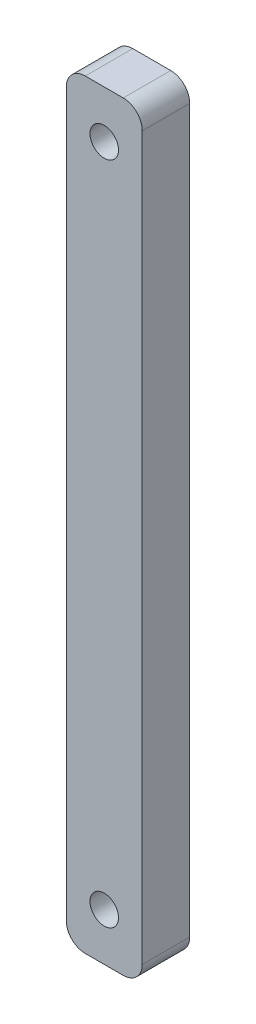
ISO-10303-21;
HEADER;
FILE_DESCRIPTION(('STEP AP214'),'2;1');
FILE_NAME('part.step','',(''),(''),'','','');
FILE_SCHEMA(('AUTOMOTIVE_DESIGN { 1 0 10303 214 1 1 1 1 }'));
ENDSEC;
DATA;
#1=APPLICATION_CONTEXT('core data for automotive mechanical design processes');
#2=APPLICATION_PROTOCOL_DEFINITION('international standard','automotive_design',2000,#1);
#3=PRODUCT_CONTEXT('',#1,'mechanical');
#4=PRODUCT('Part','Part','',(#3));
#5=PRODUCT_RELATED_PRODUCT_CATEGORY('part','',(#4));
#6=PRODUCT_DEFINITION_FORMATION('','',#4);
#7=PRODUCT_DEFINITION_CONTEXT('part definition',#1,'design');
#8=PRODUCT_DEFINITION('design','',#6,#7);
#9=PRODUCT_DEFINITION_SHAPE('','',#8);
#10=(LENGTH_UNIT() NAMED_UNIT(*) SI_UNIT(.MILLI.,.METRE.));
#11=(NAMED_UNIT(*) PLANE_ANGLE_UNIT() SI_UNIT($,.RADIAN.));
#12=(NAMED_UNIT(*) SI_UNIT($,.STERADIAN.) SOLID_ANGLE_UNIT());
#13=UNCERTAINTY_MEASURE_WITH_UNIT(LENGTH_MEASURE(1.E-05),#10,'distance_accuracy_value','');
#14=(GEOMETRIC_REPRESENTATION_CONTEXT(3) GLOBAL_UNCERTAINTY_ASSIGNED_CONTEXT((#13)) GLOBAL_UNIT_ASSIGNED_CONTEXT((#10,
#11,#12)) REPRESENTATION_CONTEXT('',''));
#15=CARTESIAN_POINT('',(0.,0.,0.));
#16=DIRECTION('',(0.,0.,1.));
#17=DIRECTION('',(1.,0.,0.));
#18=AXIS2_PLACEMENT_3D('',#15,#16,#17);
#19=CARTESIAN_POINT('',(-4.,-40.,5.));
#20=DIRECTION('',(1.,0.,0.));
#21=DIRECTION('',(0.,0.,-1.));
#22=AXIS2_PLACEMENT_3D('',#19,#20,#21);
#23=PLANE('',#22);
#24=DIRECTION('',(0.,-1.,0.));
#25=VECTOR('',#24,1.);
#26=CARTESIAN_POINT('',(-4.,-40.,0.));
#27=LINE('',#26,#25);
#28=CARTESIAN_POINT('',(-4.,38.,0.));
#29=VERTEX_POINT('',#28);
#30=CARTESIAN_POINT('',(-4.,-38.,0.));
#31=VERTEX_POINT('',#30);
#32=EDGE_CURVE('E139',#29,#31,#27,.T.);
#33=ORIENTED_EDGE('',*,*,#32,.T.);
#34=DIRECTION('',(0.,0.,-1.));
#35=VECTOR('',#34,1.);
#36=CARTESIAN_POINT('',(-4.,-38.,5.));
#37=LINE('',#36,#35);
#38=CARTESIAN_POINT('',(-4.,-38.,5.));
#39=VERTEX_POINT('',#38);
#40=EDGE_CURVE('E114',#31,#39,#37,.F.);
#41=ORIENTED_EDGE('',*,*,#40,.T.);
#42=DIRECTION('',(0.,-1.,0.));
#43=VECTOR('',#42,1.);
#44=CARTESIAN_POINT('',(-4.,-40.,5.));
#45=LINE('',#44,#43);
#46=CARTESIAN_POINT('',(-4.,38.,5.));
#47=VERTEX_POINT('',#46);
#48=EDGE_CURVE('E152',#47,#39,#45,.T.);
#49=ORIENTED_EDGE('',*,*,#48,.F.);
#50=DIRECTION('',(0.,0.,-1.));
#51=VECTOR('',#50,1.);
#52=CARTESIAN_POINT('',(-4.,38.,5.));
#53=LINE('',#52,#51);
#54=EDGE_CURVE('E120',#47,#29,#53,.T.);
#55=ORIENTED_EDGE('',*,*,#54,.T.);
#56=EDGE_LOOP('',(#33,#41,#49,#55));
#57=FACE_BOUND('',#56,.T.);
#58=ADVANCED_FACE('F42',(#57),#23,.F.);
#59=CARTESIAN_POINT('',(4.,-40.,5.));
#60=DIRECTION('',(0.,1.,0.));
#61=DIRECTION('',(0.,0.,1.));
#62=AXIS2_PLACEMENT_3D('',#59,#60,#61);
#63=PLANE('',#62);
#64=DIRECTION('',(1.,0.,0.));
#65=VECTOR('',#64,1.);
#66=CARTESIAN_POINT('',(4.,-40.,5.));
#67=LINE('',#66,#65);
#68=CARTESIAN_POINT('',(-2.,-40.,5.));
#69=VERTEX_POINT('',#68);
#70=CARTESIAN_POINT('',(2.,-40.,5.));
#71=VERTEX_POINT('',#70);
#72=EDGE_CURVE('E130',#69,#71,#67,.T.);
#73=ORIENTED_EDGE('',*,*,#72,.F.);
#74=DIRECTION('',(0.,0.,-1.));
#75=VECTOR('',#74,1.);
#76=CARTESIAN_POINT('',(-2.,-40.,5.));
#77=LINE('',#76,#75);
#78=CARTESIAN_POINT('',(-2.,-40.,0.));
#79=VERTEX_POINT('',#78);
#80=EDGE_CURVE('E113',#69,#79,#77,.T.);
#81=ORIENTED_EDGE('',*,*,#80,.T.);
#82=DIRECTION('',(1.,0.,0.));
#83=VECTOR('',#82,1.);
#84=CARTESIAN_POINT('',(4.,-40.,0.));
#85=LINE('',#84,#83);
#86=CARTESIAN_POINT('',(2.,-40.,0.));
#87=VERTEX_POINT('',#86);
#88=EDGE_CURVE('E127',#79,#87,#85,.T.);
#89=ORIENTED_EDGE('',*,*,#88,.T.);
#90=DIRECTION('',(0.,0.,-1.));
#91=VECTOR('',#90,1.);
#92=CARTESIAN_POINT('',(2.,-40.,5.));
#93=LINE('',#92,#91);
#94=EDGE_CURVE('E133',#87,#71,#93,.F.);
#95=ORIENTED_EDGE('',*,*,#94,.T.);
#96=EDGE_LOOP('',(#73,#81,#89,#95));
#97=FACE_BOUND('',#96,.T.);
#98=ADVANCED_FACE('F126',(#97),#63,.F.);
#99=CARTESIAN_POINT('',(4.,-40.,5.));
#100=DIRECTION('',(-1.,0.,0.));
#101=DIRECTION('',(0.,0.,1.));
#102=AXIS2_PLACEMENT_3D('',#99,#100,#101);
#103=PLANE('',#102);
#104=DIRECTION('',(0.,1.,0.));
#105=VECTOR('',#104,1.);
#106=CARTESIAN_POINT('',(4.,-40.,5.));
#107=LINE('',#106,#105);
#108=CARTESIAN_POINT('',(4.,-38.,5.));
#109=VERTEX_POINT('',#108);
#110=CARTESIAN_POINT('',(4.,38.,5.));
#111=VERTEX_POINT('',#110);
#112=EDGE_CURVE('E188',#109,#111,#107,.T.);
#113=ORIENTED_EDGE('',*,*,#112,.F.);
#114=DIRECTION('',(0.,0.,-1.));
#115=VECTOR('',#114,1.);
#116=CARTESIAN_POINT('',(4.,-38.,5.));
#117=LINE('',#116,#115);
#118=CARTESIAN_POINT('',(4.,-38.,0.));
#119=VERTEX_POINT('',#118);
#120=EDGE_CURVE('E182',#109,#119,#117,.T.);
#121=ORIENTED_EDGE('',*,*,#120,.T.);
#122=DIRECTION('',(0.,1.,0.));
#123=VECTOR('',#122,1.);
#124=CARTESIAN_POINT('',(4.,-40.,0.));
#125=LINE('',#124,#123);
#126=CARTESIAN_POINT('',(4.,38.,0.));
#127=VERTEX_POINT('',#126);
#128=EDGE_CURVE('E138',#119,#127,#125,.T.);
#129=ORIENTED_EDGE('',*,*,#128,.T.);
#130=DIRECTION('',(0.,0.,-1.));
#131=VECTOR('',#130,1.);
#132=CARTESIAN_POINT('',(4.,38.,5.));
#133=LINE('',#132,#131);
#134=EDGE_CURVE('E179',#127,#111,#133,.F.);
#135=ORIENTED_EDGE('',*,*,#134,.T.);
#136=EDGE_LOOP('',(#113,#121,#129,#135));
#137=FACE_BOUND('',#136,.T.);
#138=ADVANCED_FACE('F245',(#137),#103,.F.);
#139=CARTESIAN_POINT('',(4.,40.,5.));
#140=DIRECTION('',(0.,-1.,0.));
#141=DIRECTION('',(0.,0.,-1.));
#142=AXIS2_PLACEMENT_3D('',#139,#140,#141);
#143=PLANE('',#142);
#144=DIRECTION('',(-1.,0.,0.));
#145=VECTOR('',#144,1.);
#146=CARTESIAN_POINT('',(4.,40.,5.));
#147=LINE('',#146,#145);
#148=CARTESIAN_POINT('',(2.,40.,5.));
#149=VERTEX_POINT('',#148);
#150=CARTESIAN_POINT('',(-2.,40.,5.));
#151=VERTEX_POINT('',#150);
#152=EDGE_CURVE('E154',#149,#151,#147,.T.);
#153=ORIENTED_EDGE('',*,*,#152,.F.);
#154=DIRECTION('',(0.,0.,-1.));
#155=VECTOR('',#154,1.);
#156=CARTESIAN_POINT('',(2.,40.,5.));
#157=LINE('',#156,#155);
#158=CARTESIAN_POINT('',(2.,40.,0.));
#159=VERTEX_POINT('',#158);
#160=EDGE_CURVE('E11',#149,#159,#157,.T.);
#161=ORIENTED_EDGE('',*,*,#160,.T.);
#162=DIRECTION('',(-1.,0.,0.));
#163=VECTOR('',#162,1.);
#164=CARTESIAN_POINT('',(4.,40.,0.));
#165=LINE('',#164,#163);
#166=CARTESIAN_POINT('',(-2.,40.,0.));
#167=VERTEX_POINT('',#166);
#168=EDGE_CURVE('E144',#159,#167,#165,.T.);
#169=ORIENTED_EDGE('',*,*,#168,.T.);
#170=DIRECTION('',(0.,0.,-1.));
#171=VECTOR('',#170,1.);
#172=CARTESIAN_POINT('',(-2.,40.,5.));
#173=LINE('',#172,#171);
#174=EDGE_CURVE('E51',#167,#151,#173,.F.);
#175=ORIENTED_EDGE('',*,*,#174,.T.);
#176=EDGE_LOOP('',(#153,#161,#169,#175));
#177=FACE_BOUND('',#176,.T.);
#178=ADVANCED_FACE('F225',(#177),#143,.F.);
#179=CARTESIAN_POINT('',(0.,0.,5.));
#180=DIRECTION('',(0.,0.,1.));
#181=DIRECTION('',(1.,0.,0.));
#182=AXIS2_PLACEMENT_3D('',#179,#180,#181);
#183=PLANE('',#182);
#184=CARTESIAN_POINT('',(0.,35.,5.));
#185=DIRECTION('',(0.,0.,1.));
#186=DIRECTION('',(1.,0.,0.));
#187=AXIS2_PLACEMENT_3D('',#184,#185,#186);
#188=CIRCLE('',#187,1.5);
#189=CARTESIAN_POINT('',(1.5,35.,5.));
#190=VERTEX_POINT('',#189);
#191=EDGE_CURVE('E205',#190,#190,#188,.T.);
#192=ORIENTED_EDGE('',*,*,#191,.F.);
#193=EDGE_LOOP('',(#192));
#194=FACE_BOUND('',#193,.T.);
#195=CARTESIAN_POINT('',(0.,-35.,5.));
#196=DIRECTION('',(0.,0.,1.));
#197=DIRECTION('',(1.,0.,0.));
#198=AXIS2_PLACEMENT_3D('',#195,#196,#197);
#199=CIRCLE('',#198,1.5);
#200=CARTESIAN_POINT('',(1.50000000000001,-35.,5.));
#201=VERTEX_POINT('',#200);
#202=EDGE_CURVE('E201',#201,#201,#199,.T.);
#203=ORIENTED_EDGE('',*,*,#202,.F.);
#204=EDGE_LOOP('',(#203));
#205=FACE_BOUND('',#204,.T.);
#206=ORIENTED_EDGE('',*,*,#48,.T.);
#207=CARTESIAN_POINT('',(-2.,-38.,5.));
#208=DIRECTION('',(0.,0.,1.));
#209=DIRECTION('',(1.,0.,0.));
#210=AXIS2_PLACEMENT_3D('',#207,#208,#209);
#211=CIRCLE('',#210,2.);
#212=EDGE_CURVE('E176',#39,#69,#211,.T.);
#213=ORIENTED_EDGE('',*,*,#212,.T.);
#214=ORIENTED_EDGE('',*,*,#72,.T.);
#215=CARTESIAN_POINT('',(2.,-38.,5.));
#216=DIRECTION('',(0.,0.,1.));
#217=DIRECTION('',(1.,0.,0.));
#218=AXIS2_PLACEMENT_3D('',#215,#216,#217);
#219=CIRCLE('',#218,2.);
#220=EDGE_CURVE('E173',#71,#109,#219,.T.);
#221=ORIENTED_EDGE('',*,*,#220,.T.);
#222=ORIENTED_EDGE('',*,*,#112,.T.);
#223=CARTESIAN_POINT('',(2.,38.,5.));
#224=DIRECTION('',(0.,0.,1.));
#225=DIRECTION('',(1.,0.,0.));
#226=AXIS2_PLACEMENT_3D('',#223,#224,#225);
#227=CIRCLE('',#226,2.);
#228=EDGE_CURVE('E64',#111,#149,#227,.T.);
#229=ORIENTED_EDGE('',*,*,#228,.T.);
#230=ORIENTED_EDGE('',*,*,#152,.T.);
#231=CARTESIAN_POINT('',(-2.,38.,5.));
#232=DIRECTION('',(0.,0.,1.));
#233=DIRECTION('',(1.,0.,0.));
#234=AXIS2_PLACEMENT_3D('',#231,#232,#233);
#235=CIRCLE('',#234,2.);
#236=EDGE_CURVE('E168',#151,#47,#235,.T.);
#237=ORIENTED_EDGE('',*,*,#236,.T.);
#238=EDGE_LOOP('',(#206,#213,#214,#221,#222,#229,#230,#237));
#239=FACE_BOUND('',#238,.T.);
#240=ADVANCED_FACE('F222',(#194,#205,#239),#183,.T.);
#241=CARTESIAN_POINT('',(0.,0.,0.));
#242=DIRECTION('',(0.,0.,1.));
#243=DIRECTION('',(1.,0.,0.));
#244=AXIS2_PLACEMENT_3D('',#241,#242,#243);
#245=PLANE('',#244);
#246=CARTESIAN_POINT('',(0.,35.,0.));
#247=DIRECTION('',(0.,0.,1.));
#248=DIRECTION('',(1.,0.,0.));
#249=AXIS2_PLACEMENT_3D('',#246,#247,#248);
#250=CIRCLE('',#249,1.5);
#251=CARTESIAN_POINT('',(1.5,35.,0.));
#252=VERTEX_POINT('',#251);
#253=EDGE_CURVE('E146',#252,#252,#250,.T.);
#254=ORIENTED_EDGE('',*,*,#253,.T.);
#255=EDGE_LOOP('',(#254));
#256=FACE_BOUND('',#255,.T.);
#257=CARTESIAN_POINT('',(0.,-35.,0.));
#258=DIRECTION('',(0.,0.,1.));
#259=DIRECTION('',(1.,0.,0.));
#260=AXIS2_PLACEMENT_3D('',#257,#258,#259);
#261=CIRCLE('',#260,1.5);
#262=CARTESIAN_POINT('',(1.50000000000001,-35.,0.));
#263=VERTEX_POINT('',#262);
#264=EDGE_CURVE('E197',#263,#263,#261,.T.);
#265=ORIENTED_EDGE('',*,*,#264,.T.);
#266=EDGE_LOOP('',(#265));
#267=FACE_BOUND('',#266,.T.);
#268=ORIENTED_EDGE('',*,*,#88,.F.);
#269=CARTESIAN_POINT('',(-2.,-38.,0.));
#270=DIRECTION('',(0.,0.,1.));
#271=DIRECTION('',(1.,0.,0.));
#272=AXIS2_PLACEMENT_3D('',#269,#270,#271);
#273=CIRCLE('',#272,2.);
#274=EDGE_CURVE('E109',#79,#31,#273,.F.);
#275=ORIENTED_EDGE('',*,*,#274,.T.);
#276=ORIENTED_EDGE('',*,*,#32,.F.);
#277=CARTESIAN_POINT('',(-2.,38.,0.));
#278=DIRECTION('',(0.,0.,1.));
#279=DIRECTION('',(1.,0.,0.));
#280=AXIS2_PLACEMENT_3D('',#277,#278,#279);
#281=CIRCLE('',#280,2.);
#282=EDGE_CURVE('E132',#29,#167,#281,.F.);
#283=ORIENTED_EDGE('',*,*,#282,.T.);
#284=ORIENTED_EDGE('',*,*,#168,.F.);
#285=CARTESIAN_POINT('',(2.,38.,0.));
#286=DIRECTION('',(0.,0.,1.));
#287=DIRECTION('',(1.,0.,0.));
#288=AXIS2_PLACEMENT_3D('',#285,#286,#287);
#289=CIRCLE('',#288,2.);
#290=EDGE_CURVE('E158',#159,#127,#289,.F.);
#291=ORIENTED_EDGE('',*,*,#290,.T.);
#292=ORIENTED_EDGE('',*,*,#128,.F.);
#293=CARTESIAN_POINT('',(2.,-38.,0.));
#294=DIRECTION('',(0.,0.,1.));
#295=DIRECTION('',(1.,0.,0.));
#296=AXIS2_PLACEMENT_3D('',#293,#294,#295);
#297=CIRCLE('',#296,2.);
#298=EDGE_CURVE('E121',#119,#87,#297,.F.);
#299=ORIENTED_EDGE('',*,*,#298,.T.);
#300=EDGE_LOOP('',(#268,#275,#276,#283,#284,#291,#292,#299));
#301=FACE_BOUND('',#300,.T.);
#302=ADVANCED_FACE('F135',(#256,#267,#301),#245,.F.);
#303=CARTESIAN_POINT('',(0.,-35.,0.));
#304=DIRECTION('',(0.,0.,1.));
#305=DIRECTION('',(1.,0.,0.));
#306=AXIS2_PLACEMENT_3D('',#303,#304,#305);
#307=CYLINDRICAL_SURFACE('',#306,1.5);
#308=ORIENTED_EDGE('',*,*,#264,.F.);
#309=EDGE_LOOP('',(#308));
#310=FACE_BOUND('',#309,.T.);
#311=ORIENTED_EDGE('',*,*,#202,.T.);
#312=EDGE_LOOP('',(#311));
#313=FACE_BOUND('',#312,.T.);
#314=ADVANCED_FACE('F218',(#310,#313),#307,.F.);
#315=CARTESIAN_POINT('',(0.,35.,0.));
#316=DIRECTION('',(0.,0.,1.));
#317=DIRECTION('',(1.,0.,0.));
#318=AXIS2_PLACEMENT_3D('',#315,#316,#317);
#319=CYLINDRICAL_SURFACE('',#318,1.5);
#320=ORIENTED_EDGE('',*,*,#253,.F.);
#321=EDGE_LOOP('',(#320));
#322=FACE_BOUND('',#321,.T.);
#323=ORIENTED_EDGE('',*,*,#191,.T.);
#324=EDGE_LOOP('',(#323));
#325=FACE_BOUND('',#324,.T.);
#326=ADVANCED_FACE('F215',(#322,#325),#319,.F.);
#327=CARTESIAN_POINT('',(-2.,-38.,5.));
#328=DIRECTION('',(0.,0.,-1.));
#329=DIRECTION('',(-1.,0.,0.));
#330=AXIS2_PLACEMENT_3D('',#327,#328,#329);
#331=CYLINDRICAL_SURFACE('',#330,2.);
#332=ORIENTED_EDGE('',*,*,#212,.F.);
#333=ORIENTED_EDGE('',*,*,#40,.F.);
#334=ORIENTED_EDGE('',*,*,#274,.F.);
#335=ORIENTED_EDGE('',*,*,#80,.F.);
#336=EDGE_LOOP('',(#332,#333,#334,#335));
#337=FACE_BOUND('',#336,.T.);
#338=ADVANCED_FACE('F112',(#337),#331,.T.);
#339=CARTESIAN_POINT('',(2.,-38.,5.));
#340=DIRECTION('',(0.,0.,-1.));
#341=DIRECTION('',(-1.,0.,0.));
#342=AXIS2_PLACEMENT_3D('',#339,#340,#341);
#343=CYLINDRICAL_SURFACE('',#342,2.);
#344=ORIENTED_EDGE('',*,*,#220,.F.);
#345=ORIENTED_EDGE('',*,*,#94,.F.);
#346=ORIENTED_EDGE('',*,*,#298,.F.);
#347=ORIENTED_EDGE('',*,*,#120,.F.);
#348=EDGE_LOOP('',(#344,#345,#346,#347));
#349=FACE_BOUND('',#348,.T.);
#350=ADVANCED_FACE('F251',(#349),#343,.T.);
#351=CARTESIAN_POINT('',(2.,38.,5.));
#352=DIRECTION('',(0.,0.,-1.));
#353=DIRECTION('',(-1.,0.,0.));
#354=AXIS2_PLACEMENT_3D('',#351,#352,#353);
#355=CYLINDRICAL_SURFACE('',#354,2.);
#356=ORIENTED_EDGE('',*,*,#228,.F.);
#357=ORIENTED_EDGE('',*,*,#134,.F.);
#358=ORIENTED_EDGE('',*,*,#290,.F.);
#359=ORIENTED_EDGE('',*,*,#160,.F.);
#360=EDGE_LOOP('',(#356,#357,#358,#359));
#361=FACE_BOUND('',#360,.T.);
#362=ADVANCED_FACE('F253',(#361),#355,.T.);
#363=CARTESIAN_POINT('',(-2.,38.,5.));
#364=DIRECTION('',(0.,0.,-1.));
#365=DIRECTION('',(-1.,0.,0.));
#366=AXIS2_PLACEMENT_3D('',#363,#364,#365);
#367=CYLINDRICAL_SURFACE('',#366,2.);
#368=ORIENTED_EDGE('',*,*,#236,.F.);
#369=ORIENTED_EDGE('',*,*,#174,.F.);
#370=ORIENTED_EDGE('',*,*,#282,.F.);
#371=ORIENTED_EDGE('',*,*,#54,.F.);
#372=EDGE_LOOP('',(#368,#369,#370,#371));
#373=FACE_BOUND('',#372,.T.);
#374=ADVANCED_FACE('F44',(#373),#367,.T.);
#375=CLOSED_SHELL('',(#58,#98,#138,#178,#240,#302,#314,#326,#338,#350,#362,#374));
#376=MANIFOLD_SOLID_BREP('B2',#375);
#377=ADVANCED_BREP_SHAPE_REPRESENTATION('',(#18,#376),#14);
#378=SHAPE_DEFINITION_REPRESENTATION(#9,#377);
ENDSEC;
END-ISO-10303-21;
